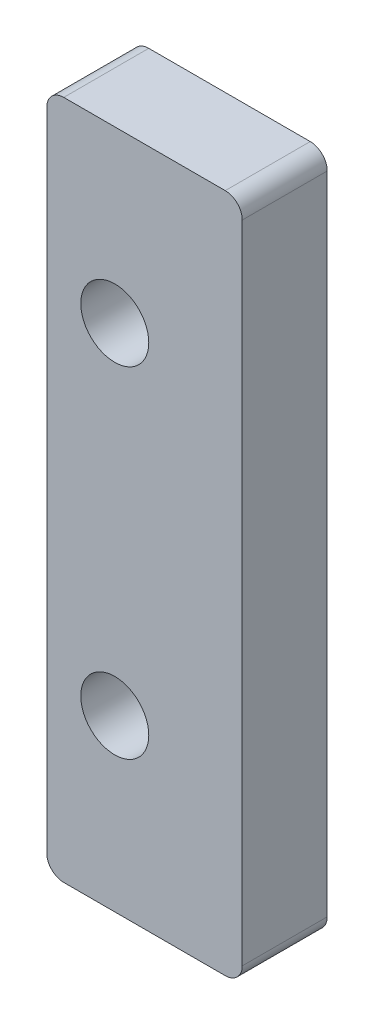
ISO-10303-21;
HEADER;
FILE_DESCRIPTION(('STEP AP214'),'2;1');
FILE_NAME('part.step','',(''),(''),'','','');
FILE_SCHEMA(('AUTOMOTIVE_DESIGN { 1 0 10303 214 1 1 1 1 }'));
ENDSEC;
DATA;
#1=APPLICATION_CONTEXT('core data for automotive mechanical design processes');
#2=APPLICATION_PROTOCOL_DEFINITION('international standard','automotive_design',2000,#1);
#3=PRODUCT_CONTEXT('',#1,'mechanical');
#4=PRODUCT('Part','Part','',(#3));
#5=PRODUCT_RELATED_PRODUCT_CATEGORY('part','',(#4));
#6=PRODUCT_DEFINITION_FORMATION('','',#4);
#7=PRODUCT_DEFINITION_CONTEXT('part definition',#1,'design');
#8=PRODUCT_DEFINITION('design','',#6,#7);
#9=PRODUCT_DEFINITION_SHAPE('','',#8);
#10=(LENGTH_UNIT() NAMED_UNIT(*) SI_UNIT(.MILLI.,.METRE.));
#11=(NAMED_UNIT(*) PLANE_ANGLE_UNIT() SI_UNIT($,.RADIAN.));
#12=(NAMED_UNIT(*) SI_UNIT($,.STERADIAN.) SOLID_ANGLE_UNIT());
#13=UNCERTAINTY_MEASURE_WITH_UNIT(LENGTH_MEASURE(1.E-05),#10,'distance_accuracy_value','');
#14=(GEOMETRIC_REPRESENTATION_CONTEXT(3) GLOBAL_UNCERTAINTY_ASSIGNED_CONTEXT((#13)) GLOBAL_UNIT_ASSIGNED_CONTEXT((#10,
#11,#12)) REPRESENTATION_CONTEXT('',''));
#15=CARTESIAN_POINT('',(0.,0.,0.));
#16=DIRECTION('',(0.,0.,1.));
#17=DIRECTION('',(1.,0.,0.));
#18=AXIS2_PLACEMENT_3D('',#15,#16,#17);
#19=CARTESIAN_POINT('',(0.,0.,5.));
#20=DIRECTION('',(0.,0.,-1.));
#21=DIRECTION('',(-1.,0.,0.));
#22=AXIS2_PLACEMENT_3D('',#19,#20,#21);
#23=PLANE('',#22);
#24=DIRECTION('',(1.,0.,0.));
#25=VECTOR('',#24,1.);
#26=CARTESIAN_POINT('',(0.,0.,5.));
#27=LINE('',#26,#25);
#28=CARTESIAN_POINT('',(1.,0.,5.));
#29=VERTEX_POINT('',#28);
#30=CARTESIAN_POINT('',(10.5,0.,5.));
#31=VERTEX_POINT('',#30);
#32=EDGE_CURVE('E171',#29,#31,#27,.T.);
#33=ORIENTED_EDGE('',*,*,#32,.T.);
#34=CARTESIAN_POINT('',(10.5,1.,5.));
#35=DIRECTION('',(0.,0.,-1.));
#36=DIRECTION('',(-1.,0.,0.));
#37=AXIS2_PLACEMENT_3D('',#34,#35,#36);
#38=CIRCLE('',#37,1.);
#39=CARTESIAN_POINT('',(11.5,1.,5.));
#40=VERTEX_POINT('',#39);
#41=EDGE_CURVE('E149',#31,#40,#38,.F.);
#42=ORIENTED_EDGE('',*,*,#41,.T.);
#43=DIRECTION('',(0.,1.,0.));
#44=VECTOR('',#43,1.);
#45=CARTESIAN_POINT('',(11.5,0.,5.));
#46=LINE('',#45,#44);
#47=CARTESIAN_POINT('',(11.5,39.,5.));
#48=VERTEX_POINT('',#47);
#49=EDGE_CURVE('E119',#40,#48,#46,.T.);
#50=ORIENTED_EDGE('',*,*,#49,.T.);
#51=CARTESIAN_POINT('',(10.5,39.,5.));
#52=DIRECTION('',(0.,0.,-1.));
#53=DIRECTION('',(-1.,0.,0.));
#54=AXIS2_PLACEMENT_3D('',#51,#52,#53);
#55=CIRCLE('',#54,1.);
#56=CARTESIAN_POINT('',(10.5,40.,5.));
#57=VERTEX_POINT('',#56);
#58=EDGE_CURVE('E55',#48,#57,#55,.F.);
#59=ORIENTED_EDGE('',*,*,#58,.T.);
#60=DIRECTION('',(-1.,0.,0.));
#61=VECTOR('',#60,1.);
#62=CARTESIAN_POINT('',(0.,40.,5.));
#63=LINE('',#62,#61);
#64=CARTESIAN_POINT('',(1.,40.,5.));
#65=VERTEX_POINT('',#64);
#66=EDGE_CURVE('E135',#57,#65,#63,.T.);
#67=ORIENTED_EDGE('',*,*,#66,.T.);
#68=CARTESIAN_POINT('',(1.,39.,5.));
#69=DIRECTION('',(0.,0.,-1.));
#70=DIRECTION('',(-1.,0.,0.));
#71=AXIS2_PLACEMENT_3D('',#68,#69,#70);
#72=CIRCLE('',#71,1.);
#73=CARTESIAN_POINT('',(0.,39.,5.));
#74=VERTEX_POINT('',#73);
#75=EDGE_CURVE('E145',#65,#74,#72,.F.);
#76=ORIENTED_EDGE('',*,*,#75,.T.);
#77=DIRECTION('',(0.,-1.,0.));
#78=VECTOR('',#77,1.);
#79=CARTESIAN_POINT('',(0.,0.,5.));
#80=LINE('',#79,#78);
#81=CARTESIAN_POINT('',(0.,1.,5.));
#82=VERTEX_POINT('',#81);
#83=EDGE_CURVE('E129',#74,#82,#80,.T.);
#84=ORIENTED_EDGE('',*,*,#83,.T.);
#85=CARTESIAN_POINT('',(1.,1.,5.));
#86=DIRECTION('',(0.,0.,-1.));
#87=DIRECTION('',(-1.,0.,0.));
#88=AXIS2_PLACEMENT_3D('',#85,#86,#87);
#89=CIRCLE('',#88,1.);
#90=EDGE_CURVE('E147',#82,#29,#89,.F.);
#91=ORIENTED_EDGE('',*,*,#90,.T.);
#92=EDGE_LOOP('',(#33,#42,#50,#59,#67,#76,#84,#91));
#93=FACE_BOUND('',#92,.T.);
#94=CARTESIAN_POINT('',(4.,10.,5.));
#95=DIRECTION('',(0.,0.,1.));
#96=DIRECTION('',(1.,0.,0.));
#97=AXIS2_PLACEMENT_3D('',#94,#95,#96);
#98=CIRCLE('',#97,2.);
#99=CARTESIAN_POINT('',(6.,10.,5.));
#100=VERTEX_POINT('',#99);
#101=EDGE_CURVE('E180',#100,#100,#98,.T.);
#102=ORIENTED_EDGE('',*,*,#101,.F.);
#103=EDGE_LOOP('',(#102));
#104=FACE_BOUND('',#103,.T.);
#105=CARTESIAN_POINT('',(4.,30.,5.));
#106=DIRECTION('',(0.,0.,1.));
#107=DIRECTION('',(1.,0.,0.));
#108=AXIS2_PLACEMENT_3D('',#105,#106,#107);
#109=CIRCLE('',#108,2.);
#110=CARTESIAN_POINT('',(6.,30.,5.));
#111=VERTEX_POINT('',#110);
#112=EDGE_CURVE('E185',#111,#111,#109,.T.);
#113=ORIENTED_EDGE('',*,*,#112,.F.);
#114=EDGE_LOOP('',(#113));
#115=FACE_BOUND('',#114,.T.);
#116=ADVANCED_FACE('F35',(#93,#104,#115),#23,.F.);
#117=CARTESIAN_POINT('',(0.,0.,0.));
#118=DIRECTION('',(0.,0.,-1.));
#119=DIRECTION('',(-1.,0.,0.));
#120=AXIS2_PLACEMENT_3D('',#117,#118,#119);
#121=PLANE('',#120);
#122=CARTESIAN_POINT('',(4.,10.,0.));
#123=DIRECTION('',(0.,0.,1.));
#124=DIRECTION('',(1.,0.,0.));
#125=AXIS2_PLACEMENT_3D('',#122,#123,#124);
#126=CIRCLE('',#125,2.);
#127=CARTESIAN_POINT('',(6.,10.,0.));
#128=VERTEX_POINT('',#127);
#129=EDGE_CURVE('E176',#128,#128,#126,.T.);
#130=ORIENTED_EDGE('',*,*,#129,.T.);
#131=EDGE_LOOP('',(#130));
#132=FACE_BOUND('',#131,.T.);
#133=DIRECTION('',(0.,1.,0.));
#134=VECTOR('',#133,1.);
#135=CARTESIAN_POINT('',(11.5,0.,0.));
#136=LINE('',#135,#134);
#137=CARTESIAN_POINT('',(11.5,1.,0.));
#138=VERTEX_POINT('',#137);
#139=CARTESIAN_POINT('',(11.5,39.,0.));
#140=VERTEX_POINT('',#139);
#141=EDGE_CURVE('E117',#138,#140,#136,.T.);
#142=ORIENTED_EDGE('',*,*,#141,.F.);
#143=CARTESIAN_POINT('',(10.5,1.,0.));
#144=DIRECTION('',(0.,0.,-1.));
#145=DIRECTION('',(-1.,0.,0.));
#146=AXIS2_PLACEMENT_3D('',#143,#144,#145);
#147=CIRCLE('',#146,1.);
#148=CARTESIAN_POINT('',(10.5,0.,0.));
#149=VERTEX_POINT('',#148);
#150=EDGE_CURVE('E100',#138,#149,#147,.T.);
#151=ORIENTED_EDGE('',*,*,#150,.T.);
#152=DIRECTION('',(1.,0.,0.));
#153=VECTOR('',#152,1.);
#154=CARTESIAN_POINT('',(0.,0.,0.));
#155=LINE('',#154,#153);
#156=CARTESIAN_POINT('',(1.,0.,0.));
#157=VERTEX_POINT('',#156);
#158=EDGE_CURVE('E127',#157,#149,#155,.T.);
#159=ORIENTED_EDGE('',*,*,#158,.F.);
#160=CARTESIAN_POINT('',(1.,1.,0.));
#161=DIRECTION('',(0.,0.,-1.));
#162=DIRECTION('',(-1.,0.,0.));
#163=AXIS2_PLACEMENT_3D('',#160,#161,#162);
#164=CIRCLE('',#163,1.);
#165=CARTESIAN_POINT('',(0.,1.,0.));
#166=VERTEX_POINT('',#165);
#167=EDGE_CURVE('E111',#157,#166,#164,.T.);
#168=ORIENTED_EDGE('',*,*,#167,.T.);
#169=DIRECTION('',(0.,-1.,0.));
#170=VECTOR('',#169,1.);
#171=CARTESIAN_POINT('',(0.,0.,0.));
#172=LINE('',#171,#170);
#173=CARTESIAN_POINT('',(0.,39.,0.));
#174=VERTEX_POINT('',#173);
#175=EDGE_CURVE('E131',#174,#166,#172,.T.);
#176=ORIENTED_EDGE('',*,*,#175,.F.);
#177=CARTESIAN_POINT('',(1.,39.,0.));
#178=DIRECTION('',(0.,0.,-1.));
#179=DIRECTION('',(-1.,0.,0.));
#180=AXIS2_PLACEMENT_3D('',#177,#178,#179);
#181=CIRCLE('',#180,1.);
#182=CARTESIAN_POINT('',(1.,40.,0.));
#183=VERTEX_POINT('',#182);
#184=EDGE_CURVE('E138',#174,#183,#181,.T.);
#185=ORIENTED_EDGE('',*,*,#184,.T.);
#186=DIRECTION('',(-1.,0.,0.));
#187=VECTOR('',#186,1.);
#188=CARTESIAN_POINT('',(0.,40.,0.));
#189=LINE('',#188,#187);
#190=CARTESIAN_POINT('',(10.5,40.,0.));
#191=VERTEX_POINT('',#190);
#192=EDGE_CURVE('E126',#191,#183,#189,.T.);
#193=ORIENTED_EDGE('',*,*,#192,.F.);
#194=CARTESIAN_POINT('',(10.5,39.,0.));
#195=DIRECTION('',(0.,0.,-1.));
#196=DIRECTION('',(-1.,0.,0.));
#197=AXIS2_PLACEMENT_3D('',#194,#195,#196);
#198=CIRCLE('',#197,1.);
#199=EDGE_CURVE('E120',#191,#140,#198,.T.);
#200=ORIENTED_EDGE('',*,*,#199,.T.);
#201=EDGE_LOOP('',(#142,#151,#159,#168,#176,#185,#193,#200));
#202=FACE_BOUND('',#201,.T.);
#203=CARTESIAN_POINT('',(4.,30.,0.));
#204=DIRECTION('',(0.,0.,1.));
#205=DIRECTION('',(1.,0.,0.));
#206=AXIS2_PLACEMENT_3D('',#203,#204,#205);
#207=CIRCLE('',#206,2.);
#208=CARTESIAN_POINT('',(6.,30.,0.));
#209=VERTEX_POINT('',#208);
#210=EDGE_CURVE('E187',#209,#209,#207,.T.);
#211=ORIENTED_EDGE('',*,*,#210,.T.);
#212=EDGE_LOOP('',(#211));
#213=FACE_BOUND('',#212,.T.);
#214=ADVANCED_FACE('F123',(#132,#202,#213),#121,.T.);
#215=CARTESIAN_POINT('',(0.,0.,5.));
#216=DIRECTION('',(1.,0.,0.));
#217=DIRECTION('',(0.,0.,-1.));
#218=AXIS2_PLACEMENT_3D('',#215,#216,#217);
#219=PLANE('',#218);
#220=ORIENTED_EDGE('',*,*,#175,.T.);
#221=DIRECTION('',(0.,0.,-1.));
#222=VECTOR('',#221,1.);
#223=CARTESIAN_POINT('',(0.,1.,5.));
#224=LINE('',#223,#222);
#225=EDGE_CURVE('E154',#166,#82,#224,.F.);
#226=ORIENTED_EDGE('',*,*,#225,.T.);
#227=ORIENTED_EDGE('',*,*,#83,.F.);
#228=DIRECTION('',(0.,0.,-1.));
#229=VECTOR('',#228,1.);
#230=CARTESIAN_POINT('',(0.,39.,5.));
#231=LINE('',#230,#229);
#232=EDGE_CURVE('E151',#74,#174,#231,.T.);
#233=ORIENTED_EDGE('',*,*,#232,.T.);
#234=EDGE_LOOP('',(#220,#226,#227,#233));
#235=FACE_BOUND('',#234,.T.);
#236=ADVANCED_FACE('F167',(#235),#219,.F.);
#237=CARTESIAN_POINT('',(0.,0.,5.));
#238=DIRECTION('',(0.,1.,0.));
#239=DIRECTION('',(0.,0.,1.));
#240=AXIS2_PLACEMENT_3D('',#237,#238,#239);
#241=PLANE('',#240);
#242=ORIENTED_EDGE('',*,*,#158,.T.);
#243=DIRECTION('',(0.,0.,-1.));
#244=VECTOR('',#243,1.);
#245=CARTESIAN_POINT('',(10.5,0.,5.));
#246=LINE('',#245,#244);
#247=EDGE_CURVE('E105',#149,#31,#246,.F.);
#248=ORIENTED_EDGE('',*,*,#247,.T.);
#249=ORIENTED_EDGE('',*,*,#32,.F.);
#250=DIRECTION('',(0.,0.,-1.));
#251=VECTOR('',#250,1.);
#252=CARTESIAN_POINT('',(1.,0.,5.));
#253=LINE('',#252,#251);
#254=EDGE_CURVE('E110',#29,#157,#253,.T.);
#255=ORIENTED_EDGE('',*,*,#254,.T.);
#256=EDGE_LOOP('',(#242,#248,#249,#255));
#257=FACE_BOUND('',#256,.T.);
#258=ADVANCED_FACE('F212',(#257),#241,.F.);
#259=CARTESIAN_POINT('',(11.5,0.,5.));
#260=DIRECTION('',(-1.,0.,0.));
#261=DIRECTION('',(0.,0.,1.));
#262=AXIS2_PLACEMENT_3D('',#259,#260,#261);
#263=PLANE('',#262);
#264=ORIENTED_EDGE('',*,*,#49,.F.);
#265=DIRECTION('',(0.,0.,-1.));
#266=VECTOR('',#265,1.);
#267=CARTESIAN_POINT('',(11.5,1.,5.));
#268=LINE('',#267,#266);
#269=EDGE_CURVE('E104',#40,#138,#268,.T.);
#270=ORIENTED_EDGE('',*,*,#269,.T.);
#271=ORIENTED_EDGE('',*,*,#141,.T.);
#272=DIRECTION('',(0.,0.,-1.));
#273=VECTOR('',#272,1.);
#274=CARTESIAN_POINT('',(11.5,39.,5.));
#275=LINE('',#274,#273);
#276=EDGE_CURVE('E121',#140,#48,#275,.F.);
#277=ORIENTED_EDGE('',*,*,#276,.T.);
#278=EDGE_LOOP('',(#264,#270,#271,#277));
#279=FACE_BOUND('',#278,.T.);
#280=ADVANCED_FACE('F116',(#279),#263,.F.);
#281=CARTESIAN_POINT('',(0.,40.,5.));
#282=DIRECTION('',(0.,-1.,0.));
#283=DIRECTION('',(0.,0.,-1.));
#284=AXIS2_PLACEMENT_3D('',#281,#282,#283);
#285=PLANE('',#284);
#286=ORIENTED_EDGE('',*,*,#192,.T.);
#287=DIRECTION('',(0.,0.,-1.));
#288=VECTOR('',#287,1.);
#289=CARTESIAN_POINT('',(1.,40.,5.));
#290=LINE('',#289,#288);
#291=EDGE_CURVE('E11',#183,#65,#290,.F.);
#292=ORIENTED_EDGE('',*,*,#291,.T.);
#293=ORIENTED_EDGE('',*,*,#66,.F.);
#294=DIRECTION('',(0.,0.,-1.));
#295=VECTOR('',#294,1.);
#296=CARTESIAN_POINT('',(10.5,40.,5.));
#297=LINE('',#296,#295);
#298=EDGE_CURVE('E43',#57,#191,#297,.T.);
#299=ORIENTED_EDGE('',*,*,#298,.T.);
#300=EDGE_LOOP('',(#286,#292,#293,#299));
#301=FACE_BOUND('',#300,.T.);
#302=ADVANCED_FACE('F157',(#301),#285,.F.);
#303=CARTESIAN_POINT('',(4.,10.,5.));
#304=DIRECTION('',(0.,0.,-1.));
#305=DIRECTION('',(-1.,0.,0.));
#306=AXIS2_PLACEMENT_3D('',#303,#304,#305);
#307=CYLINDRICAL_SURFACE('',#306,2.);
#308=ORIENTED_EDGE('',*,*,#101,.T.);
#309=EDGE_LOOP('',(#308));
#310=FACE_BOUND('',#309,.T.);
#311=ORIENTED_EDGE('',*,*,#129,.F.);
#312=EDGE_LOOP('',(#311));
#313=FACE_BOUND('',#312,.T.);
#314=ADVANCED_FACE('F205',(#310,#313),#307,.F.);
#315=CARTESIAN_POINT('',(4.,30.,5.));
#316=DIRECTION('',(0.,0.,-1.));
#317=DIRECTION('',(-1.,0.,0.));
#318=AXIS2_PLACEMENT_3D('',#315,#316,#317);
#319=CYLINDRICAL_SURFACE('',#318,2.);
#320=ORIENTED_EDGE('',*,*,#112,.T.);
#321=EDGE_LOOP('',(#320));
#322=FACE_BOUND('',#321,.T.);
#323=ORIENTED_EDGE('',*,*,#210,.F.);
#324=EDGE_LOOP('',(#323));
#325=FACE_BOUND('',#324,.T.);
#326=ADVANCED_FACE('F193',(#322,#325),#319,.F.);
#327=CARTESIAN_POINT('',(10.5,1.,5.));
#328=DIRECTION('',(0.,0.,-1.));
#329=DIRECTION('',(-1.,0.,0.));
#330=AXIS2_PLACEMENT_3D('',#327,#328,#329);
#331=CYLINDRICAL_SURFACE('',#330,1.);
#332=ORIENTED_EDGE('',*,*,#41,.F.);
#333=ORIENTED_EDGE('',*,*,#247,.F.);
#334=ORIENTED_EDGE('',*,*,#150,.F.);
#335=ORIENTED_EDGE('',*,*,#269,.F.);
#336=EDGE_LOOP('',(#332,#333,#334,#335));
#337=FACE_BOUND('',#336,.T.);
#338=ADVANCED_FACE('F103',(#337),#331,.T.);
#339=CARTESIAN_POINT('',(1.,1.,5.));
#340=DIRECTION('',(0.,0.,-1.));
#341=DIRECTION('',(-1.,0.,0.));
#342=AXIS2_PLACEMENT_3D('',#339,#340,#341);
#343=CYLINDRICAL_SURFACE('',#342,1.);
#344=ORIENTED_EDGE('',*,*,#90,.F.);
#345=ORIENTED_EDGE('',*,*,#225,.F.);
#346=ORIENTED_EDGE('',*,*,#167,.F.);
#347=ORIENTED_EDGE('',*,*,#254,.F.);
#348=EDGE_LOOP('',(#344,#345,#346,#347));
#349=FACE_BOUND('',#348,.T.);
#350=ADVANCED_FACE('F220',(#349),#343,.T.);
#351=CARTESIAN_POINT('',(1.,39.,5.));
#352=DIRECTION('',(0.,0.,-1.));
#353=DIRECTION('',(-1.,0.,0.));
#354=AXIS2_PLACEMENT_3D('',#351,#352,#353);
#355=CYLINDRICAL_SURFACE('',#354,1.);
#356=ORIENTED_EDGE('',*,*,#75,.F.);
#357=ORIENTED_EDGE('',*,*,#291,.F.);
#358=ORIENTED_EDGE('',*,*,#184,.F.);
#359=ORIENTED_EDGE('',*,*,#232,.F.);
#360=EDGE_LOOP('',(#356,#357,#358,#359));
#361=FACE_BOUND('',#360,.T.);
#362=ADVANCED_FACE('F164',(#361),#355,.T.);
#363=CARTESIAN_POINT('',(10.5,39.,5.));
#364=DIRECTION('',(0.,0.,-1.));
#365=DIRECTION('',(-1.,0.,0.));
#366=AXIS2_PLACEMENT_3D('',#363,#364,#365);
#367=CYLINDRICAL_SURFACE('',#366,1.);
#368=ORIENTED_EDGE('',*,*,#58,.F.);
#369=ORIENTED_EDGE('',*,*,#276,.F.);
#370=ORIENTED_EDGE('',*,*,#199,.F.);
#371=ORIENTED_EDGE('',*,*,#298,.F.);
#372=EDGE_LOOP('',(#368,#369,#370,#371));
#373=FACE_BOUND('',#372,.T.);
#374=ADVANCED_FACE('F37',(#373),#367,.T.);
#375=CLOSED_SHELL('',(#116,#214,#236,#258,#280,#302,#314,#326,#338,#350,#362,#374));
#376=MANIFOLD_SOLID_BREP('B2',#375);
#377=ADVANCED_BREP_SHAPE_REPRESENTATION('',(#18,#376),#14);
#378=SHAPE_DEFINITION_REPRESENTATION(#9,#377);
ENDSEC;
END-ISO-10303-21;
